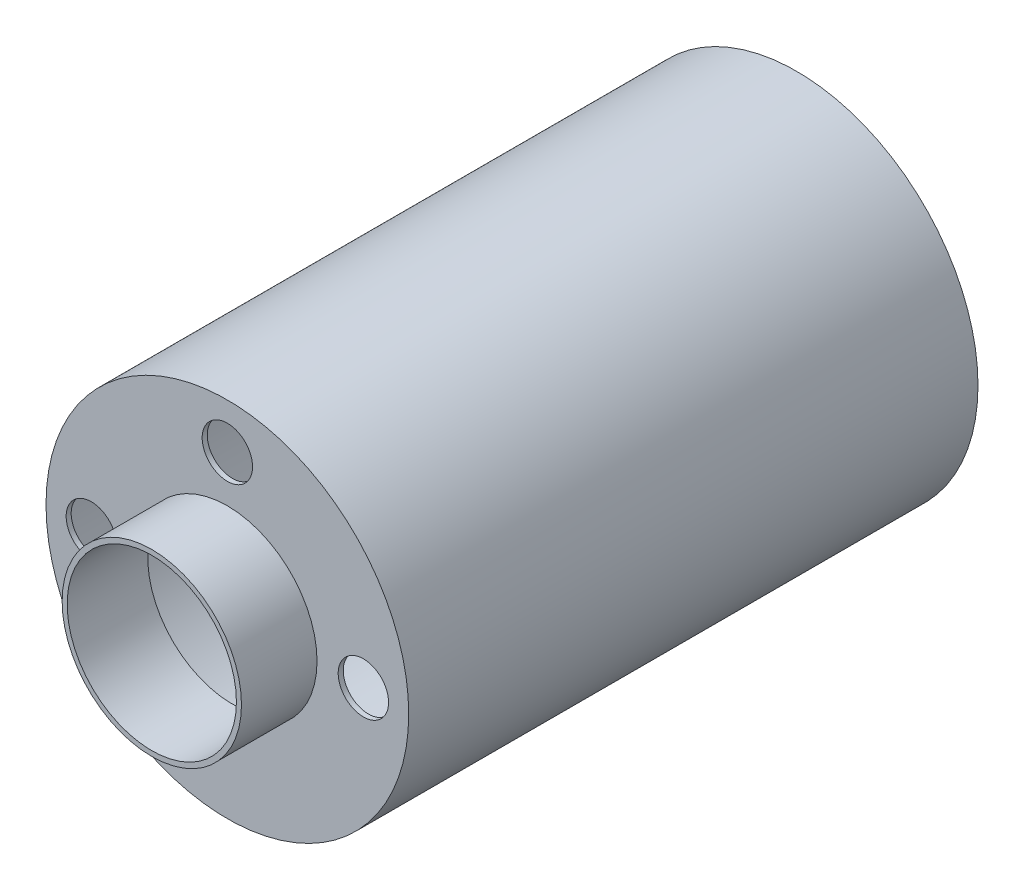
ISO-10303-21;
HEADER;
FILE_DESCRIPTION(('STEP AP214'),'2;1');
FILE_NAME('part.step','',(''),(''),'','','');
FILE_SCHEMA(('AUTOMOTIVE_DESIGN { 1 0 10303 214 1 1 1 1 }'));
ENDSEC;
DATA;
#1=APPLICATION_CONTEXT('core data for automotive mechanical design processes');
#2=APPLICATION_PROTOCOL_DEFINITION('international standard','automotive_design',2000,#1);
#3=PRODUCT_CONTEXT('',#1,'mechanical');
#4=PRODUCT('Part','Part','',(#3));
#5=PRODUCT_RELATED_PRODUCT_CATEGORY('part','',(#4));
#6=PRODUCT_DEFINITION_FORMATION('','',#4);
#7=PRODUCT_DEFINITION_CONTEXT('part definition',#1,'design');
#8=PRODUCT_DEFINITION('design','',#6,#7);
#9=PRODUCT_DEFINITION_SHAPE('','',#8);
#10=(LENGTH_UNIT() NAMED_UNIT(*) SI_UNIT(.MILLI.,.METRE.));
#11=(NAMED_UNIT(*) PLANE_ANGLE_UNIT() SI_UNIT($,.RADIAN.));
#12=(NAMED_UNIT(*) SI_UNIT($,.STERADIAN.) SOLID_ANGLE_UNIT());
#13=UNCERTAINTY_MEASURE_WITH_UNIT(LENGTH_MEASURE(1.E-05),#10,'distance_accuracy_value','');
#14=(GEOMETRIC_REPRESENTATION_CONTEXT(3) GLOBAL_UNCERTAINTY_ASSIGNED_CONTEXT((#13)) GLOBAL_UNIT_ASSIGNED_CONTEXT((#10,
#11,#12)) REPRESENTATION_CONTEXT('',''));
#15=CARTESIAN_POINT('',(0.,0.,0.));
#16=DIRECTION('',(0.,0.,1.));
#17=DIRECTION('',(1.,0.,0.));
#18=AXIS2_PLACEMENT_3D('',#15,#16,#17);
#19=CARTESIAN_POINT('',(0.,0.,28.25));
#20=DIRECTION('',(0.,0.,-1.));
#21=DIRECTION('',(-1.,0.,0.));
#22=AXIS2_PLACEMENT_3D('',#19,#20,#21);
#23=CYLINDRICAL_SURFACE('',#22,18.);
#24=CARTESIAN_POINT('',(0.,0.,28.25));
#25=DIRECTION('',(0.,0.,1.));
#26=DIRECTION('',(1.,0.,0.));
#27=AXIS2_PLACEMENT_3D('',#24,#25,#26);
#28=CIRCLE('',#27,18.);
#29=CARTESIAN_POINT('',(18.,0.,28.25));
#30=VERTEX_POINT('',#29);
#31=EDGE_CURVE('E43',#30,#30,#28,.T.);
#32=ORIENTED_EDGE('',*,*,#31,.F.);
#33=EDGE_LOOP('',(#32));
#34=FACE_BOUND('',#33,.T.);
#35=CARTESIAN_POINT('',(0.,0.,-28.25));
#36=DIRECTION('',(0.,0.,1.));
#37=DIRECTION('',(1.,0.,0.));
#38=AXIS2_PLACEMENT_3D('',#35,#36,#37);
#39=CIRCLE('',#38,18.);
#40=CARTESIAN_POINT('',(18.,0.,-28.25));
#41=VERTEX_POINT('',#40);
#42=EDGE_CURVE('E48',#41,#41,#39,.T.);
#43=ORIENTED_EDGE('',*,*,#42,.T.);
#44=EDGE_LOOP('',(#43));
#45=FACE_BOUND('',#44,.T.);
#46=ADVANCED_FACE('F36',(#34,#45),#23,.T.);
#47=CARTESIAN_POINT('',(0.,0.,28.25));
#48=DIRECTION('',(0.,0.,1.));
#49=DIRECTION('',(1.,0.,0.));
#50=AXIS2_PLACEMENT_3D('',#47,#48,#49);
#51=PLANE('',#50);
#52=CARTESIAN_POINT('',(-13.5,0.,28.25));
#53=DIRECTION('',(0.,0.,1.));
#54=DIRECTION('',(1.,0.,0.));
#55=AXIS2_PLACEMENT_3D('',#52,#53,#54);
#56=CIRCLE('',#55,2.5);
#57=CARTESIAN_POINT('',(-11.,0.,28.25));
#58=VERTEX_POINT('',#57);
#59=EDGE_CURVE('E59',#58,#58,#56,.T.);
#60=ORIENTED_EDGE('',*,*,#59,.F.);
#61=EDGE_LOOP('',(#60));
#62=FACE_BOUND('',#61,.T.);
#63=CARTESIAN_POINT('',(0.,13.5,28.25));
#64=DIRECTION('',(0.,0.,1.));
#65=DIRECTION('',(1.,0.,0.));
#66=AXIS2_PLACEMENT_3D('',#63,#64,#65);
#67=CIRCLE('',#66,2.5);
#68=CARTESIAN_POINT('',(2.50000000000005,13.5,28.25));
#69=VERTEX_POINT('',#68);
#70=EDGE_CURVE('E83',#69,#69,#67,.T.);
#71=ORIENTED_EDGE('',*,*,#70,.F.);
#72=EDGE_LOOP('',(#71));
#73=FACE_BOUND('',#72,.T.);
#74=CARTESIAN_POINT('',(13.5,0.,28.25));
#75=DIRECTION('',(0.,0.,1.));
#76=DIRECTION('',(1.,0.,0.));
#77=AXIS2_PLACEMENT_3D('',#74,#75,#76);
#78=CIRCLE('',#77,2.5);
#79=CARTESIAN_POINT('',(16.,0.,28.25));
#80=VERTEX_POINT('',#79);
#81=EDGE_CURVE('E80',#80,#80,#78,.T.);
#82=ORIENTED_EDGE('',*,*,#81,.F.);
#83=EDGE_LOOP('',(#82));
#84=FACE_BOUND('',#83,.T.);
#85=CARTESIAN_POINT('',(0.,0.,28.25));
#86=DIRECTION('',(0.,0.,1.));
#87=DIRECTION('',(1.,0.,0.));
#88=AXIS2_PLACEMENT_3D('',#85,#86,#87);
#89=CIRCLE('',#88,8.9);
#90=CARTESIAN_POINT('',(8.9,0.,28.25));
#91=VERTEX_POINT('',#90);
#92=EDGE_CURVE('E10',#91,#91,#89,.T.);
#93=ORIENTED_EDGE('',*,*,#92,.F.);
#94=EDGE_LOOP('',(#93));
#95=FACE_BOUND('',#94,.T.);
#96=ORIENTED_EDGE('',*,*,#31,.T.);
#97=EDGE_LOOP('',(#96));
#98=FACE_BOUND('',#97,.T.);
#99=ADVANCED_FACE('F92',(#62,#73,#84,#95,#98),#51,.T.);
#100=CARTESIAN_POINT('',(0.,0.,-28.25));
#101=DIRECTION('',(0.,0.,1.));
#102=DIRECTION('',(1.,0.,0.));
#103=AXIS2_PLACEMENT_3D('',#100,#101,#102);
#104=PLANE('',#103);
#105=CARTESIAN_POINT('',(0.,0.,-28.25));
#106=DIRECTION('',(0.,0.,1.));
#107=DIRECTION('',(1.,0.,0.));
#108=AXIS2_PLACEMENT_3D('',#105,#106,#107);
#109=CIRCLE('',#108,17.5);
#110=CARTESIAN_POINT('',(17.5,0.,-28.25));
#111=VERTEX_POINT('',#110);
#112=EDGE_CURVE('E68',#111,#111,#109,.T.);
#113=ORIENTED_EDGE('',*,*,#112,.T.);
#114=EDGE_LOOP('',(#113));
#115=FACE_BOUND('',#114,.T.);
#116=ORIENTED_EDGE('',*,*,#42,.F.);
#117=EDGE_LOOP('',(#116));
#118=FACE_BOUND('',#117,.T.);
#119=ADVANCED_FACE('F95',(#115,#118),#104,.F.);
#120=CARTESIAN_POINT('',(0.,0.,35.75));
#121=DIRECTION('',(0.,0.,-1.));
#122=DIRECTION('',(-1.,0.,0.));
#123=AXIS2_PLACEMENT_3D('',#120,#121,#122);
#124=CYLINDRICAL_SURFACE('',#123,8.9);
#125=CARTESIAN_POINT('',(0.,0.,35.75));
#126=DIRECTION('',(0.,0.,1.));
#127=DIRECTION('',(1.,0.,0.));
#128=AXIS2_PLACEMENT_3D('',#125,#126,#127);
#129=CIRCLE('',#128,8.9);
#130=CARTESIAN_POINT('',(8.9,0.,35.75));
#131=VERTEX_POINT('',#130);
#132=EDGE_CURVE('E51',#131,#131,#129,.T.);
#133=ORIENTED_EDGE('',*,*,#132,.F.);
#134=EDGE_LOOP('',(#133));
#135=FACE_BOUND('',#134,.T.);
#136=ORIENTED_EDGE('',*,*,#92,.T.);
#137=EDGE_LOOP('',(#136));
#138=FACE_BOUND('',#137,.T.);
#139=ADVANCED_FACE('F109',(#135,#138),#124,.T.);
#140=CARTESIAN_POINT('',(0.,0.,35.75));
#141=DIRECTION('',(0.,0.,1.));
#142=DIRECTION('',(1.,0.,0.));
#143=AXIS2_PLACEMENT_3D('',#140,#141,#142);
#144=PLANE('',#143);
#145=CARTESIAN_POINT('',(0.,0.,35.75));
#146=DIRECTION('',(0.,0.,1.));
#147=DIRECTION('',(1.,0.,0.));
#148=AXIS2_PLACEMENT_3D('',#145,#146,#147);
#149=CIRCLE('',#148,8.4);
#150=CARTESIAN_POINT('',(8.4,0.,35.75));
#151=VERTEX_POINT('',#150);
#152=EDGE_CURVE('E64',#151,#151,#149,.T.);
#153=ORIENTED_EDGE('',*,*,#152,.F.);
#154=EDGE_LOOP('',(#153));
#155=FACE_BOUND('',#154,.T.);
#156=ORIENTED_EDGE('',*,*,#132,.T.);
#157=EDGE_LOOP('',(#156));
#158=FACE_BOUND('',#157,.T.);
#159=ADVANCED_FACE('F114',(#155,#158),#144,.T.);
#160=CARTESIAN_POINT('',(0.,0.,28.25));
#161=DIRECTION('',(0.,0.,-1.));
#162=DIRECTION('',(-1.,0.,0.));
#163=AXIS2_PLACEMENT_3D('',#160,#161,#162);
#164=CYLINDRICAL_SURFACE('',#163,17.5);
#165=CARTESIAN_POINT('',(0.,0.,27.75));
#166=DIRECTION('',(0.,0.,1.));
#167=DIRECTION('',(1.,0.,0.));
#168=AXIS2_PLACEMENT_3D('',#165,#166,#167);
#169=CIRCLE('',#168,17.5);
#170=CARTESIAN_POINT('',(17.5,0.,27.75));
#171=VERTEX_POINT('',#170);
#172=EDGE_CURVE('E72',#171,#171,#169,.T.);
#173=ORIENTED_EDGE('',*,*,#172,.T.);
#174=EDGE_LOOP('',(#173));
#175=FACE_BOUND('',#174,.T.);
#176=ORIENTED_EDGE('',*,*,#112,.F.);
#177=EDGE_LOOP('',(#176));
#178=FACE_BOUND('',#177,.T.);
#179=ADVANCED_FACE('F120',(#175,#178),#164,.F.);
#180=CARTESIAN_POINT('',(0.,0.,27.75));
#181=DIRECTION('',(0.,0.,1.));
#182=DIRECTION('',(1.,0.,0.));
#183=AXIS2_PLACEMENT_3D('',#180,#181,#182);
#184=PLANE('',#183);
#185=CARTESIAN_POINT('',(-13.5,0.,27.75));
#186=DIRECTION('',(0.,0.,1.));
#187=DIRECTION('',(1.,0.,0.));
#188=AXIS2_PLACEMENT_3D('',#185,#186,#187);
#189=CIRCLE('',#188,2.5);
#190=CARTESIAN_POINT('',(-11.,0.,27.75));
#191=VERTEX_POINT('',#190);
#192=EDGE_CURVE('E39',#191,#191,#189,.T.);
#193=ORIENTED_EDGE('',*,*,#192,.T.);
#194=EDGE_LOOP('',(#193));
#195=FACE_BOUND('',#194,.T.);
#196=CARTESIAN_POINT('',(0.,13.5,27.75));
#197=DIRECTION('',(0.,0.,1.));
#198=DIRECTION('',(1.,0.,0.));
#199=AXIS2_PLACEMENT_3D('',#196,#197,#198);
#200=CIRCLE('',#199,2.5);
#201=CARTESIAN_POINT('',(2.50000000000005,13.5,27.75));
#202=VERTEX_POINT('',#201);
#203=EDGE_CURVE('E58',#202,#202,#200,.T.);
#204=ORIENTED_EDGE('',*,*,#203,.T.);
#205=EDGE_LOOP('',(#204));
#206=FACE_BOUND('',#205,.T.);
#207=CARTESIAN_POINT('',(13.5,0.,27.75));
#208=DIRECTION('',(0.,0.,1.));
#209=DIRECTION('',(1.,0.,0.));
#210=AXIS2_PLACEMENT_3D('',#207,#208,#209);
#211=CIRCLE('',#210,2.5);
#212=CARTESIAN_POINT('',(16.,0.,27.75));
#213=VERTEX_POINT('',#212);
#214=EDGE_CURVE('E56',#213,#213,#211,.T.);
#215=ORIENTED_EDGE('',*,*,#214,.T.);
#216=EDGE_LOOP('',(#215));
#217=FACE_BOUND('',#216,.T.);
#218=CARTESIAN_POINT('',(0.,0.,27.75));
#219=DIRECTION('',(0.,0.,1.));
#220=DIRECTION('',(1.,0.,0.));
#221=AXIS2_PLACEMENT_3D('',#218,#219,#220);
#222=CIRCLE('',#221,8.4);
#223=CARTESIAN_POINT('',(8.4,0.,27.75));
#224=VERTEX_POINT('',#223);
#225=EDGE_CURVE('E75',#224,#224,#222,.T.);
#226=ORIENTED_EDGE('',*,*,#225,.T.);
#227=EDGE_LOOP('',(#226));
#228=FACE_BOUND('',#227,.T.);
#229=ORIENTED_EDGE('',*,*,#172,.F.);
#230=EDGE_LOOP('',(#229));
#231=FACE_BOUND('',#230,.T.);
#232=ADVANCED_FACE('F126',(#195,#206,#217,#228,#231),#184,.F.);
#233=CARTESIAN_POINT('',(0.,0.,35.75));
#234=DIRECTION('',(0.,0.,-1.));
#235=DIRECTION('',(-1.,0.,0.));
#236=AXIS2_PLACEMENT_3D('',#233,#234,#235);
#237=CYLINDRICAL_SURFACE('',#236,8.4);
#238=ORIENTED_EDGE('',*,*,#152,.T.);
#239=EDGE_LOOP('',(#238));
#240=FACE_BOUND('',#239,.T.);
#241=ORIENTED_EDGE('',*,*,#225,.F.);
#242=EDGE_LOOP('',(#241));
#243=FACE_BOUND('',#242,.T.);
#244=ADVANCED_FACE('F122',(#240,#243),#237,.F.);
#245=CARTESIAN_POINT('',(13.5,0.,20.75));
#246=DIRECTION('',(0.,0.,1.));
#247=DIRECTION('',(1.,0.,0.));
#248=AXIS2_PLACEMENT_3D('',#245,#246,#247);
#249=CYLINDRICAL_SURFACE('',#248,2.5);
#250=ORIENTED_EDGE('',*,*,#81,.T.);
#251=EDGE_LOOP('',(#250));
#252=FACE_BOUND('',#251,.T.);
#253=ORIENTED_EDGE('',*,*,#214,.F.);
#254=EDGE_LOOP('',(#253));
#255=FACE_BOUND('',#254,.T.);
#256=ADVANCED_FACE('F125',(#252,#255),#249,.F.);
#257=CARTESIAN_POINT('',(0.,13.5,20.75));
#258=DIRECTION('',(0.,0.,1.));
#259=DIRECTION('',(1.,0.,0.));
#260=AXIS2_PLACEMENT_3D('',#257,#258,#259);
#261=CYLINDRICAL_SURFACE('',#260,2.5);
#262=ORIENTED_EDGE('',*,*,#70,.T.);
#263=EDGE_LOOP('',(#262));
#264=FACE_BOUND('',#263,.T.);
#265=ORIENTED_EDGE('',*,*,#203,.F.);
#266=EDGE_LOOP('',(#265));
#267=FACE_BOUND('',#266,.T.);
#268=ADVANCED_FACE('F134',(#264,#267),#261,.F.);
#269=CARTESIAN_POINT('',(-13.5,0.,20.75));
#270=DIRECTION('',(0.,0.,1.));
#271=DIRECTION('',(1.,0.,0.));
#272=AXIS2_PLACEMENT_3D('',#269,#270,#271);
#273=CYLINDRICAL_SURFACE('',#272,2.5);
#274=ORIENTED_EDGE('',*,*,#59,.T.);
#275=EDGE_LOOP('',(#274));
#276=FACE_BOUND('',#275,.T.);
#277=ORIENTED_EDGE('',*,*,#192,.F.);
#278=EDGE_LOOP('',(#277));
#279=FACE_BOUND('',#278,.T.);
#280=ADVANCED_FACE('F89',(#276,#279),#273,.F.);
#281=CLOSED_SHELL('',(#46,#99,#119,#139,#159,#179,#232,#244,#256,#268,#280));
#282=MANIFOLD_SOLID_BREP('B2',#281);
#283=ADVANCED_BREP_SHAPE_REPRESENTATION('',(#18,#282),#14);
#284=SHAPE_DEFINITION_REPRESENTATION(#9,#283);
ENDSEC;
END-ISO-10303-21;
